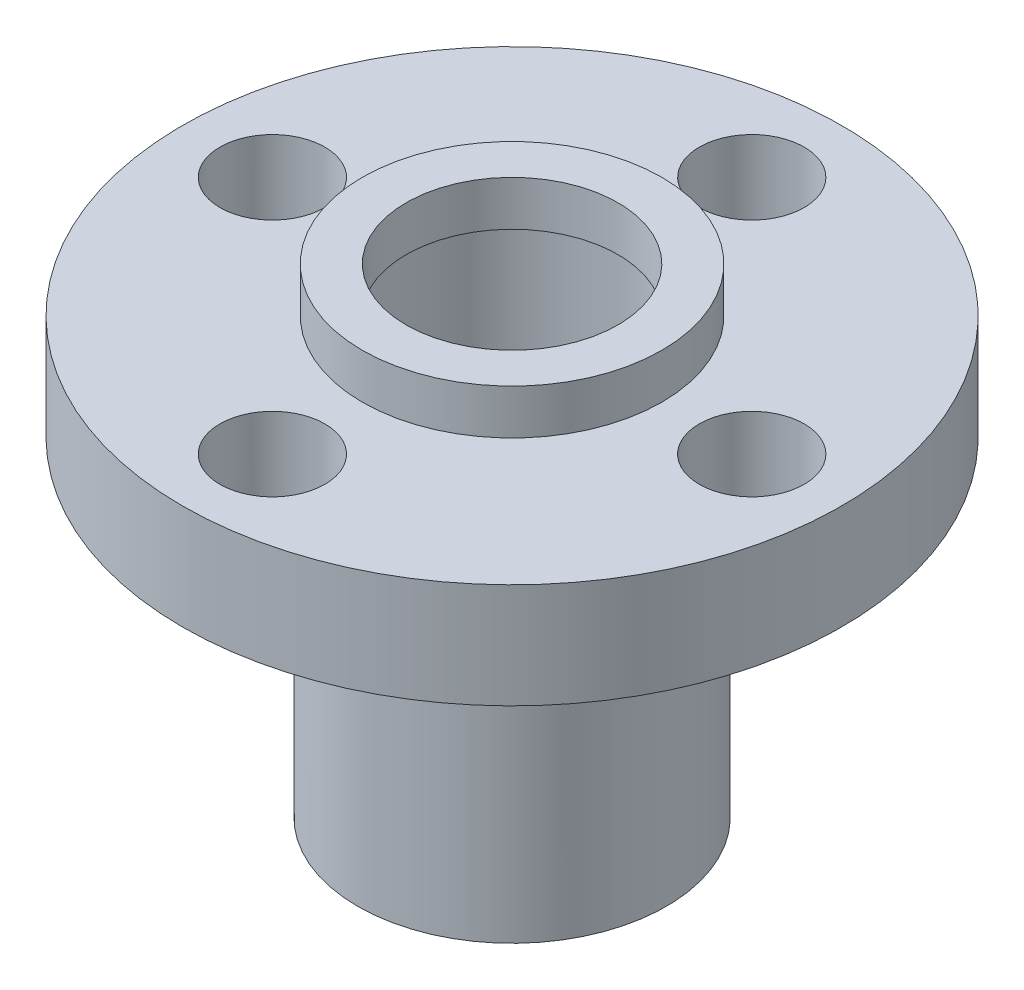
ISO-10303-21;
HEADER;
FILE_DESCRIPTION(('STEP AP214'),'2;1');
FILE_NAME('part.step','',(''),(''),'','','');
FILE_SCHEMA(('AUTOMOTIVE_DESIGN { 1 0 10303 214 1 1 1 1 }'));
ENDSEC;
DATA;
#1=APPLICATION_CONTEXT('core data for automotive mechanical design processes');
#2=APPLICATION_PROTOCOL_DEFINITION('international standard','automotive_design',2000,#1);
#3=PRODUCT_CONTEXT('',#1,'mechanical');
#4=PRODUCT('Part','Part','',(#3));
#5=PRODUCT_RELATED_PRODUCT_CATEGORY('part','',(#4));
#6=PRODUCT_DEFINITION_FORMATION('','',#4);
#7=PRODUCT_DEFINITION_CONTEXT('part definition',#1,'design');
#8=PRODUCT_DEFINITION('design','',#6,#7);
#9=PRODUCT_DEFINITION_SHAPE('','',#8);
#10=(LENGTH_UNIT() NAMED_UNIT(*) SI_UNIT(.MILLI.,.METRE.));
#11=(NAMED_UNIT(*) PLANE_ANGLE_UNIT() SI_UNIT($,.RADIAN.));
#12=(NAMED_UNIT(*) SI_UNIT($,.STERADIAN.) SOLID_ANGLE_UNIT());
#13=UNCERTAINTY_MEASURE_WITH_UNIT(LENGTH_MEASURE(1.E-05),#10,'distance_accuracy_value','');
#14=(GEOMETRIC_REPRESENTATION_CONTEXT(3) GLOBAL_UNCERTAINTY_ASSIGNED_CONTEXT((#13)) GLOBAL_UNIT_ASSIGNED_CONTEXT((#10,
#11,#12)) REPRESENTATION_CONTEXT('',''));
#15=CARTESIAN_POINT('',(0.,0.,0.));
#16=DIRECTION('',(0.,0.,1.));
#17=DIRECTION('',(1.,0.,0.));
#18=AXIS2_PLACEMENT_3D('',#15,#16,#17);
#19=CARTESIAN_POINT('',(0.,0.,0.));
#20=DIRECTION('',(0.,1.,0.));
#21=DIRECTION('',(0.,0.,1.));
#22=AXIS2_PLACEMENT_3D('',#19,#20,#21);
#23=PLANE('',#22);
#24=CARTESIAN_POINT('',(-8.,0.,0.));
#25=DIRECTION('',(0.,1.,0.));
#26=DIRECTION('',(0.,0.,1.));
#27=AXIS2_PLACEMENT_3D('',#24,#25,#26);
#28=CIRCLE('',#27,1.75);
#29=CARTESIAN_POINT('',(-8.,0.,1.74999999999992));
#30=VERTEX_POINT('',#29);
#31=EDGE_CURVE('E666',#30,#30,#28,.F.);
#32=ORIENTED_EDGE('',*,*,#31,.F.);
#33=EDGE_LOOP('',(#32));
#34=FACE_BOUND('',#33,.T.);
#35=CARTESIAN_POINT('',(0.,0.,8.));
#36=DIRECTION('',(0.,1.,0.));
#37=DIRECTION('',(0.,0.,1.));
#38=AXIS2_PLACEMENT_3D('',#35,#36,#37);
#39=CIRCLE('',#38,1.75);
#40=CARTESIAN_POINT('',(0.,0.,9.75));
#41=VERTEX_POINT('',#40);
#42=EDGE_CURVE('E660',#41,#41,#39,.F.);
#43=ORIENTED_EDGE('',*,*,#42,.F.);
#44=EDGE_LOOP('',(#43));
#45=FACE_BOUND('',#44,.T.);
#46=CARTESIAN_POINT('',(8.,0.,0.));
#47=DIRECTION('',(0.,1.,0.));
#48=DIRECTION('',(0.,0.,1.));
#49=AXIS2_PLACEMENT_3D('',#46,#47,#48);
#50=CIRCLE('',#49,1.75);
#51=CARTESIAN_POINT('',(8.,0.,1.75000000000003));
#52=VERTEX_POINT('',#51);
#53=EDGE_CURVE('E654',#52,#52,#50,.F.);
#54=ORIENTED_EDGE('',*,*,#53,.F.);
#55=EDGE_LOOP('',(#54));
#56=FACE_BOUND('',#55,.T.);
#57=CARTESIAN_POINT('',(0.,0.,-8.));
#58=DIRECTION('',(0.,1.,0.));
#59=DIRECTION('',(0.,0.,1.));
#60=AXIS2_PLACEMENT_3D('',#57,#58,#59);
#61=CIRCLE('',#60,1.75);
#62=CARTESIAN_POINT('',(0.,0.,-6.25));
#63=VERTEX_POINT('',#62);
#64=EDGE_CURVE('E648',#63,#63,#61,.F.);
#65=ORIENTED_EDGE('',*,*,#64,.F.);
#66=EDGE_LOOP('',(#65));
#67=FACE_BOUND('',#66,.T.);
#68=CARTESIAN_POINT('',(0.,0.,0.));
#69=DIRECTION('',(0.,1.,0.));
#70=DIRECTION('',(0.,0.,1.));
#71=AXIS2_PLACEMENT_3D('',#68,#69,#70);
#72=CIRCLE('',#71,11.);
#73=CARTESIAN_POINT('',(0.,0.,11.));
#74=VERTEX_POINT('',#73);
#75=EDGE_CURVE('E637',#74,#74,#72,.T.);
#76=ORIENTED_EDGE('',*,*,#75,.F.);
#77=EDGE_LOOP('',(#76));
#78=FACE_BOUND('',#77,.T.);
#79=CARTESIAN_POINT('',(0.,0.,0.));
#80=DIRECTION('',(0.,1.,0.));
#81=DIRECTION('',(0.,0.,1.));
#82=AXIS2_PLACEMENT_3D('',#79,#80,#81);
#83=CIRCLE('',#82,5.15);
#84=CARTESIAN_POINT('',(0.,0.,5.15));
#85=VERTEX_POINT('',#84);
#86=EDGE_CURVE('E13',#85,#85,#83,.F.);
#87=ORIENTED_EDGE('',*,*,#86,.F.);
#88=EDGE_LOOP('',(#87));
#89=FACE_BOUND('',#88,.T.);
#90=ADVANCED_FACE('F625',(#34,#45,#56,#67,#78,#89),#23,.F.);
#91=CARTESIAN_POINT('',(0.,3.5,0.));
#92=DIRECTION('',(0.,-1.,0.));
#93=DIRECTION('',(0.,0.,-1.));
#94=AXIS2_PLACEMENT_3D('',#91,#92,#93);
#95=CYLINDRICAL_SURFACE('',#94,11.);
#96=CARTESIAN_POINT('',(0.,3.5,0.));
#97=DIRECTION('',(0.,1.,0.));
#98=DIRECTION('',(0.,0.,1.));
#99=AXIS2_PLACEMENT_3D('',#96,#97,#98);
#100=CIRCLE('',#99,11.);
#101=CARTESIAN_POINT('',(0.,3.5,11.));
#102=VERTEX_POINT('',#101);
#103=EDGE_CURVE('E633',#102,#102,#100,.T.);
#104=ORIENTED_EDGE('',*,*,#103,.F.);
#105=EDGE_LOOP('',(#104));
#106=FACE_BOUND('',#105,.T.);
#107=ORIENTED_EDGE('',*,*,#75,.T.);
#108=EDGE_LOOP('',(#107));
#109=FACE_BOUND('',#108,.T.);
#110=ADVANCED_FACE('F627',(#106,#109),#95,.T.);
#111=CARTESIAN_POINT('',(0.,3.5,0.));
#112=DIRECTION('',(0.,1.,0.));
#113=DIRECTION('',(0.,0.,1.));
#114=AXIS2_PLACEMENT_3D('',#111,#112,#113);
#115=PLANE('',#114);
#116=CARTESIAN_POINT('',(0.,3.5,0.));
#117=DIRECTION('',(0.,1.,0.));
#118=DIRECTION('',(0.,0.,1.));
#119=AXIS2_PLACEMENT_3D('',#116,#117,#118);
#120=CIRCLE('',#119,5.);
#121=CARTESIAN_POINT('',(0.,3.5,5.));
#122=VERTEX_POINT('',#121);
#123=EDGE_CURVE('E673',#122,#122,#120,.T.);
#124=ORIENTED_EDGE('',*,*,#123,.F.);
#125=EDGE_LOOP('',(#124));
#126=FACE_BOUND('',#125,.T.);
#127=CARTESIAN_POINT('',(-8.,3.5,0.));
#128=DIRECTION('',(0.,1.,0.));
#129=DIRECTION('',(1.,0.,0.));
#130=AXIS2_PLACEMENT_3D('',#127,#128,#129);
#131=CIRCLE('',#130,1.75);
#132=CARTESIAN_POINT('',(-6.25,3.5,0.));
#133=VERTEX_POINT('',#132);
#134=EDGE_CURVE('E669',#133,#133,#131,.T.);
#135=ORIENTED_EDGE('',*,*,#134,.F.);
#136=EDGE_LOOP('',(#135));
#137=FACE_BOUND('',#136,.T.);
#138=CARTESIAN_POINT('',(0.,3.5,8.));
#139=DIRECTION('',(0.,1.,0.));
#140=DIRECTION('',(0.,0.,-1.));
#141=AXIS2_PLACEMENT_3D('',#138,#139,#140);
#142=CIRCLE('',#141,1.75);
#143=CARTESIAN_POINT('',(0.,3.5,6.25));
#144=VERTEX_POINT('',#143);
#145=EDGE_CURVE('E663',#144,#144,#142,.T.);
#146=ORIENTED_EDGE('',*,*,#145,.F.);
#147=EDGE_LOOP('',(#146));
#148=FACE_BOUND('',#147,.T.);
#149=CARTESIAN_POINT('',(8.,3.5,0.));
#150=DIRECTION('',(0.,1.,0.));
#151=DIRECTION('',(-1.,0.,0.));
#152=AXIS2_PLACEMENT_3D('',#149,#150,#151);
#153=CIRCLE('',#152,1.75);
#154=CARTESIAN_POINT('',(6.25,3.5,0.));
#155=VERTEX_POINT('',#154);
#156=EDGE_CURVE('E657',#155,#155,#153,.T.);
#157=ORIENTED_EDGE('',*,*,#156,.F.);
#158=EDGE_LOOP('',(#157));
#159=FACE_BOUND('',#158,.T.);
#160=CARTESIAN_POINT('',(0.,3.5,-8.));
#161=DIRECTION('',(0.,1.,0.));
#162=DIRECTION('',(0.,0.,1.));
#163=AXIS2_PLACEMENT_3D('',#160,#161,#162);
#164=CIRCLE('',#163,1.75);
#165=CARTESIAN_POINT('',(0.,3.5,-6.25));
#166=VERTEX_POINT('',#165);
#167=EDGE_CURVE('E651',#166,#166,#164,.T.);
#168=ORIENTED_EDGE('',*,*,#167,.F.);
#169=EDGE_LOOP('',(#168));
#170=FACE_BOUND('',#169,.T.);
#171=ORIENTED_EDGE('',*,*,#103,.T.);
#172=EDGE_LOOP('',(#171));
#173=FACE_BOUND('',#172,.T.);
#174=ADVANCED_FACE('F701',(#126,#137,#148,#159,#170,#173),#115,.T.);
#175=CARTESIAN_POINT('',(0.,-11.,0.));
#176=DIRECTION('',(0.,1.,0.));
#177=DIRECTION('',(0.,0.,1.));
#178=AXIS2_PLACEMENT_3D('',#175,#176,#177);
#179=CYLINDRICAL_SURFACE('',#178,5.15);
#180=CARTESIAN_POINT('',(0.,-11.,0.));
#181=DIRECTION('',(0.,-1.,0.));
#182=DIRECTION('',(0.,0.,-1.));
#183=AXIS2_PLACEMENT_3D('',#180,#181,#182);
#184=CIRCLE('',#183,5.15);
#185=CARTESIAN_POINT('',(0.,-11.,-5.15));
#186=VERTEX_POINT('',#185);
#187=EDGE_CURVE('E641',#186,#186,#184,.T.);
#188=ORIENTED_EDGE('',*,*,#187,.F.);
#189=EDGE_LOOP('',(#188));
#190=FACE_BOUND('',#189,.T.);
#191=ORIENTED_EDGE('',*,*,#86,.T.);
#192=EDGE_LOOP('',(#191));
#193=FACE_BOUND('',#192,.T.);
#194=ADVANCED_FACE('F704',(#190,#193),#179,.T.);
#195=CARTESIAN_POINT('',(0.,-11.,0.));
#196=DIRECTION('',(0.,-1.,0.));
#197=DIRECTION('',(0.,0.,-1.));
#198=AXIS2_PLACEMENT_3D('',#195,#196,#197);
#199=PLANE('',#198);
#200=CARTESIAN_POINT('',(0.,-11.,0.));
#201=DIRECTION('',(0.,-1.,0.));
#202=DIRECTION('',(0.,0.,-1.));
#203=AXIS2_PLACEMENT_3D('',#200,#201,#202);
#204=CIRCLE('',#203,4.);
#205=CARTESIAN_POINT('',(0.,-11.,-4.));
#206=VERTEX_POINT('',#205);
#207=EDGE_CURVE('E629',#206,#206,#204,.T.);
#208=ORIENTED_EDGE('',*,*,#207,.F.);
#209=EDGE_LOOP('',(#208));
#210=FACE_BOUND('',#209,.T.);
#211=ORIENTED_EDGE('',*,*,#187,.T.);
#212=EDGE_LOOP('',(#211));
#213=FACE_BOUND('',#212,.T.);
#214=ADVANCED_FACE('F730',(#210,#213),#199,.T.);
#215=CARTESIAN_POINT('',(0.,3.5,0.));
#216=DIRECTION('',(0.,-1.,0.));
#217=DIRECTION('',(0.,0.,-1.));
#218=AXIS2_PLACEMENT_3D('',#215,#216,#217);
#219=CYLINDRICAL_SURFACE('',#218,4.);
#220=ORIENTED_EDGE('',*,*,#207,.T.);
#221=EDGE_LOOP('',(#220));
#222=FACE_BOUND('',#221,.T.);
#223=CARTESIAN_POINT('',(0.,3.5,0.));
#224=DIRECTION('',(0.,-1.,0.));
#225=DIRECTION('',(0.,0.,-1.));
#226=AXIS2_PLACEMENT_3D('',#223,#224,#225);
#227=CIRCLE('',#226,4.);
#228=CARTESIAN_POINT('',(0.,3.5,-4.));
#229=VERTEX_POINT('',#228);
#230=EDGE_CURVE('E645',#229,#229,#227,.T.);
#231=ORIENTED_EDGE('',*,*,#230,.F.);
#232=EDGE_LOOP('',(#231));
#233=FACE_BOUND('',#232,.T.);
#234=ADVANCED_FACE('F734',(#222,#233),#219,.F.);
#235=CARTESIAN_POINT('',(0.,-11.001,-8.));
#236=DIRECTION('',(0.,1.,0.));
#237=DIRECTION('',(0.,0.,1.));
#238=AXIS2_PLACEMENT_3D('',#235,#236,#237);
#239=CYLINDRICAL_SURFACE('',#238,1.75);
#240=ORIENTED_EDGE('',*,*,#167,.T.);
#241=EDGE_LOOP('',(#240));
#242=FACE_BOUND('',#241,.T.);
#243=ORIENTED_EDGE('',*,*,#64,.T.);
#244=EDGE_LOOP('',(#243));
#245=FACE_BOUND('',#244,.T.);
#246=ADVANCED_FACE('F738',(#242,#245),#239,.F.);
#247=CARTESIAN_POINT('',(8.,-11.001,0.));
#248=DIRECTION('',(0.,1.,0.));
#249=DIRECTION('',(0.,0.,1.));
#250=AXIS2_PLACEMENT_3D('',#247,#248,#249);
#251=CYLINDRICAL_SURFACE('',#250,1.75);
#252=ORIENTED_EDGE('',*,*,#156,.T.);
#253=EDGE_LOOP('',(#252));
#254=FACE_BOUND('',#253,.T.);
#255=ORIENTED_EDGE('',*,*,#53,.T.);
#256=EDGE_LOOP('',(#255));
#257=FACE_BOUND('',#256,.T.);
#258=ADVANCED_FACE('F742',(#254,#257),#251,.F.);
#259=CARTESIAN_POINT('',(0.,-11.001,8.));
#260=DIRECTION('',(0.,1.,0.));
#261=DIRECTION('',(0.,0.,1.));
#262=AXIS2_PLACEMENT_3D('',#259,#260,#261);
#263=CYLINDRICAL_SURFACE('',#262,1.75);
#264=ORIENTED_EDGE('',*,*,#145,.T.);
#265=EDGE_LOOP('',(#264));
#266=FACE_BOUND('',#265,.T.);
#267=ORIENTED_EDGE('',*,*,#42,.T.);
#268=EDGE_LOOP('',(#267));
#269=FACE_BOUND('',#268,.T.);
#270=ADVANCED_FACE('F746',(#266,#269),#263,.F.);
#271=CARTESIAN_POINT('',(-8.,-11.001,0.));
#272=DIRECTION('',(0.,1.,0.));
#273=DIRECTION('',(0.,0.,1.));
#274=AXIS2_PLACEMENT_3D('',#271,#272,#273);
#275=CYLINDRICAL_SURFACE('',#274,1.75);
#276=ORIENTED_EDGE('',*,*,#134,.T.);
#277=EDGE_LOOP('',(#276));
#278=FACE_BOUND('',#277,.T.);
#279=ORIENTED_EDGE('',*,*,#31,.T.);
#280=EDGE_LOOP('',(#279));
#281=FACE_BOUND('',#280,.T.);
#282=ADVANCED_FACE('F750',(#278,#281),#275,.F.);
#283=CARTESIAN_POINT('',(0.,3.5,0.));
#284=DIRECTION('',(0.,1.,0.));
#285=DIRECTION('',(0.,0.,1.));
#286=AXIS2_PLACEMENT_3D('',#283,#284,#285);
#287=PLANE('',#286);
#288=CARTESIAN_POINT('',(0.,3.5,0.));
#289=DIRECTION('',(0.,1.,0.));
#290=DIRECTION('',(0.,0.,1.));
#291=AXIS2_PLACEMENT_3D('',#288,#289,#290);
#292=CIRCLE('',#291,3.53507668495339);
#293=CARTESIAN_POINT('',(0.,3.5,3.53507668495339));
#294=VERTEX_POINT('',#293);
#295=EDGE_CURVE('E676',#294,#294,#292,.T.);
#296=ORIENTED_EDGE('',*,*,#295,.T.);
#297=EDGE_LOOP('',(#296));
#298=FACE_BOUND('',#297,.T.);
#299=ORIENTED_EDGE('',*,*,#230,.T.);
#300=EDGE_LOOP('',(#299));
#301=FACE_BOUND('',#300,.T.);
#302=ADVANCED_FACE('F697',(#298,#301),#287,.F.);
#303=CARTESIAN_POINT('',(0.,5.,0.));
#304=DIRECTION('',(0.,-1.,0.));
#305=DIRECTION('',(0.,0.,-1.));
#306=AXIS2_PLACEMENT_3D('',#303,#304,#305);
#307=CYLINDRICAL_SURFACE('',#306,5.);
#308=CARTESIAN_POINT('',(0.,5.,0.));
#309=DIRECTION('',(0.,1.,0.));
#310=DIRECTION('',(0.,0.,1.));
#311=AXIS2_PLACEMENT_3D('',#308,#309,#310);
#312=CIRCLE('',#311,5.);
#313=CARTESIAN_POINT('',(0.,5.,5.));
#314=VERTEX_POINT('',#313);
#315=EDGE_CURVE('E672',#314,#314,#312,.T.);
#316=ORIENTED_EDGE('',*,*,#315,.F.);
#317=EDGE_LOOP('',(#316));
#318=FACE_BOUND('',#317,.T.);
#319=ORIENTED_EDGE('',*,*,#123,.T.);
#320=EDGE_LOOP('',(#319));
#321=FACE_BOUND('',#320,.T.);
#322=ADVANCED_FACE('F691',(#318,#321),#307,.T.);
#323=CARTESIAN_POINT('',(0.,5.,0.));
#324=DIRECTION('',(0.,1.,0.));
#325=DIRECTION('',(0.,0.,1.));
#326=AXIS2_PLACEMENT_3D('',#323,#324,#325);
#327=PLANE('',#326);
#328=CARTESIAN_POINT('',(0.,5.,0.));
#329=DIRECTION('',(0.,1.,0.));
#330=DIRECTION('',(0.,0.,1.));
#331=AXIS2_PLACEMENT_3D('',#328,#329,#330);
#332=CIRCLE('',#331,3.53507668495339);
#333=CARTESIAN_POINT('',(0.,5.,3.53507668495339));
#334=VERTEX_POINT('',#333);
#335=EDGE_CURVE('E681',#334,#334,#332,.T.);
#336=ORIENTED_EDGE('',*,*,#335,.F.);
#337=EDGE_LOOP('',(#336));
#338=FACE_BOUND('',#337,.T.);
#339=ORIENTED_EDGE('',*,*,#315,.T.);
#340=EDGE_LOOP('',(#339));
#341=FACE_BOUND('',#340,.T.);
#342=ADVANCED_FACE('F688',(#338,#341),#327,.T.);
#343=CARTESIAN_POINT('',(0.,-11.,0.));
#344=DIRECTION('',(0.,1.,0.));
#345=DIRECTION('',(0.,0.,1.));
#346=AXIS2_PLACEMENT_3D('',#343,#344,#345);
#347=CYLINDRICAL_SURFACE('',#346,3.53507668495339);
#348=ORIENTED_EDGE('',*,*,#335,.T.);
#349=EDGE_LOOP('',(#348));
#350=FACE_BOUND('',#349,.T.);
#351=ORIENTED_EDGE('',*,*,#295,.F.);
#352=EDGE_LOOP('',(#351));
#353=FACE_BOUND('',#352,.T.);
#354=ADVANCED_FACE('F685',(#350,#353),#347,.F.);
#355=CLOSED_SHELL('',(#90,#110,#174,#194,#214,#234,#246,#258,#270,#282,#302,#322,#342,#354));
#356=MANIFOLD_SOLID_BREP('B2',#355);
#357=ADVANCED_BREP_SHAPE_REPRESENTATION('',(#18,#356),#14);
#358=SHAPE_DEFINITION_REPRESENTATION(#9,#357);
ENDSEC;
END-ISO-10303-21;
